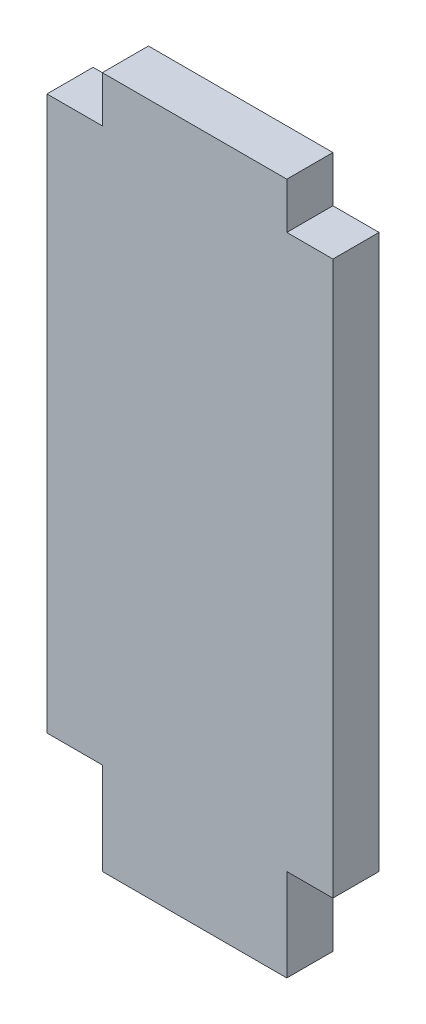
ISO-10303-21;
HEADER;
FILE_DESCRIPTION(('STEP AP214'),'2;1');
FILE_NAME('part.step','',(''),(''),'','','');
FILE_SCHEMA(('AUTOMOTIVE_DESIGN { 1 0 10303 214 1 1 1 1 }'));
ENDSEC;
DATA;
#1=APPLICATION_CONTEXT('core data for automotive mechanical design processes');
#2=APPLICATION_PROTOCOL_DEFINITION('international standard','automotive_design',2000,#1);
#3=PRODUCT_CONTEXT('',#1,'mechanical');
#4=PRODUCT('Part','Part','',(#3));
#5=PRODUCT_RELATED_PRODUCT_CATEGORY('part','',(#4));
#6=PRODUCT_DEFINITION_FORMATION('','',#4);
#7=PRODUCT_DEFINITION_CONTEXT('part definition',#1,'design');
#8=PRODUCT_DEFINITION('design','',#6,#7);
#9=PRODUCT_DEFINITION_SHAPE('','',#8);
#10=(LENGTH_UNIT() NAMED_UNIT(*) SI_UNIT(.MILLI.,.METRE.));
#11=(NAMED_UNIT(*) PLANE_ANGLE_UNIT() SI_UNIT($,.RADIAN.));
#12=(NAMED_UNIT(*) SI_UNIT($,.STERADIAN.) SOLID_ANGLE_UNIT());
#13=UNCERTAINTY_MEASURE_WITH_UNIT(LENGTH_MEASURE(1.E-05),#10,'distance_accuracy_value','');
#14=(GEOMETRIC_REPRESENTATION_CONTEXT(3) GLOBAL_UNCERTAINTY_ASSIGNED_CONTEXT((#13)) GLOBAL_UNIT_ASSIGNED_CONTEXT((#10,
#11,#12)) REPRESENTATION_CONTEXT('',''));
#15=CARTESIAN_POINT('',(0.,0.,0.));
#16=DIRECTION('',(0.,0.,1.));
#17=DIRECTION('',(1.,0.,0.));
#18=AXIS2_PLACEMENT_3D('',#15,#16,#17);
#19=CARTESIAN_POINT('',(-7.75,-13.75,2.5));
#20=DIRECTION('',(1.,0.,0.));
#21=DIRECTION('',(0.,1.,0.));
#22=AXIS2_PLACEMENT_3D('',#19,#20,#21);
#23=PLANE('',#22);
#24=DIRECTION('',(0.,-1.,0.));
#25=VECTOR('',#24,1.);
#26=CARTESIAN_POINT('',(-7.75,-13.75,0.));
#27=LINE('',#26,#25);
#28=CARTESIAN_POINT('',(-7.75,16.25,0.));
#29=VERTEX_POINT('',#28);
#30=CARTESIAN_POINT('',(-7.75,-13.75,0.));
#31=VERTEX_POINT('',#30);
#32=EDGE_CURVE('E153',#29,#31,#27,.T.);
#33=ORIENTED_EDGE('',*,*,#32,.T.);
#34=DIRECTION('',(0.,0.,-1.));
#35=VECTOR('',#34,1.);
#36=CARTESIAN_POINT('',(-7.75,-13.75,2.5));
#37=LINE('',#36,#35);
#38=CARTESIAN_POINT('',(-7.75,-13.75,2.5));
#39=VERTEX_POINT('',#38);
#40=EDGE_CURVE('E11',#39,#31,#37,.T.);
#41=ORIENTED_EDGE('',*,*,#40,.F.);
#42=DIRECTION('',(0.,-1.,0.));
#43=VECTOR('',#42,1.);
#44=CARTESIAN_POINT('',(-7.75,-13.75,2.5));
#45=LINE('',#44,#43);
#46=CARTESIAN_POINT('',(-7.75,16.25,2.5));
#47=VERTEX_POINT('',#46);
#48=EDGE_CURVE('E175',#47,#39,#45,.T.);
#49=ORIENTED_EDGE('',*,*,#48,.F.);
#50=DIRECTION('',(0.,0.,-1.));
#51=VECTOR('',#50,1.);
#52=CARTESIAN_POINT('',(-7.75,16.25,2.5));
#53=LINE('',#52,#51);
#54=EDGE_CURVE('E149',#47,#29,#53,.T.);
#55=ORIENTED_EDGE('',*,*,#54,.T.);
#56=EDGE_LOOP('',(#33,#41,#49,#55));
#57=FACE_BOUND('',#56,.T.);
#58=ADVANCED_FACE('F33',(#57),#23,.F.);
#59=CARTESIAN_POINT('',(-4.75,-13.75,2.5));
#60=DIRECTION('',(0.,1.,0.));
#61=DIRECTION('',(0.,0.,1.));
#62=AXIS2_PLACEMENT_3D('',#59,#60,#61);
#63=PLANE('',#62);
#64=DIRECTION('',(1.,0.,0.));
#65=VECTOR('',#64,1.);
#66=CARTESIAN_POINT('',(-4.75,-13.75,0.));
#67=LINE('',#66,#65);
#68=CARTESIAN_POINT('',(-4.75,-13.75,0.));
#69=VERTEX_POINT('',#68);
#70=EDGE_CURVE('E156',#31,#69,#67,.T.);
#71=ORIENTED_EDGE('',*,*,#70,.T.);
#72=DIRECTION('',(0.,0.,-1.));
#73=VECTOR('',#72,1.);
#74=CARTESIAN_POINT('',(-4.75,-13.75,2.5));
#75=LINE('',#74,#73);
#76=CARTESIAN_POINT('',(-4.75,-13.75,2.5));
#77=VERTEX_POINT('',#76);
#78=EDGE_CURVE('E41',#77,#69,#75,.T.);
#79=ORIENTED_EDGE('',*,*,#78,.F.);
#80=DIRECTION('',(1.,0.,0.));
#81=VECTOR('',#80,1.);
#82=CARTESIAN_POINT('',(-4.75,-13.75,2.5));
#83=LINE('',#82,#81);
#84=EDGE_CURVE('E104',#39,#77,#83,.T.);
#85=ORIENTED_EDGE('',*,*,#84,.F.);
#86=ORIENTED_EDGE('',*,*,#40,.T.);
#87=EDGE_LOOP('',(#71,#79,#85,#86));
#88=FACE_BOUND('',#87,.T.);
#89=ADVANCED_FACE('F253',(#88),#63,.F.);
#90=CARTESIAN_POINT('',(-4.75,-18.75,2.5));
#91=DIRECTION('',(1.,0.,0.));
#92=DIRECTION('',(0.,0.,-1.));
#93=AXIS2_PLACEMENT_3D('',#90,#91,#92);
#94=PLANE('',#93);
#95=DIRECTION('',(0.,-1.,0.));
#96=VECTOR('',#95,1.);
#97=CARTESIAN_POINT('',(-4.75,-18.75,0.));
#98=LINE('',#97,#96);
#99=CARTESIAN_POINT('',(-4.75,-18.75,0.));
#100=VERTEX_POINT('',#99);
#101=EDGE_CURVE('E158',#69,#100,#98,.T.);
#102=ORIENTED_EDGE('',*,*,#101,.T.);
#103=DIRECTION('',(0.,0.,-1.));
#104=VECTOR('',#103,1.);
#105=CARTESIAN_POINT('',(-4.75,-18.75,2.5));
#106=LINE('',#105,#104);
#107=CARTESIAN_POINT('',(-4.75,-18.75,2.5));
#108=VERTEX_POINT('',#107);
#109=EDGE_CURVE('E194',#108,#100,#106,.T.);
#110=ORIENTED_EDGE('',*,*,#109,.F.);
#111=DIRECTION('',(0.,-1.,0.));
#112=VECTOR('',#111,1.);
#113=CARTESIAN_POINT('',(-4.75,-18.75,2.5));
#114=LINE('',#113,#112);
#115=EDGE_CURVE('E202',#77,#108,#114,.T.);
#116=ORIENTED_EDGE('',*,*,#115,.F.);
#117=ORIENTED_EDGE('',*,*,#78,.T.);
#118=EDGE_LOOP('',(#102,#110,#116,#117));
#119=FACE_BOUND('',#118,.T.);
#120=ADVANCED_FACE('F200',(#119),#94,.F.);
#121=CARTESIAN_POINT('',(5.25,-18.75,2.5));
#122=DIRECTION('',(0.,1.,0.));
#123=DIRECTION('',(0.,0.,1.));
#124=AXIS2_PLACEMENT_3D('',#121,#122,#123);
#125=PLANE('',#124);
#126=DIRECTION('',(1.,0.,0.));
#127=VECTOR('',#126,1.);
#128=CARTESIAN_POINT('',(5.25,-18.75,0.));
#129=LINE('',#128,#127);
#130=CARTESIAN_POINT('',(5.25,-18.75,0.));
#131=VERTEX_POINT('',#130);
#132=EDGE_CURVE('E160',#100,#131,#129,.T.);
#133=ORIENTED_EDGE('',*,*,#132,.T.);
#134=DIRECTION('',(0.,0.,-1.));
#135=VECTOR('',#134,1.);
#136=CARTESIAN_POINT('',(5.25,-18.75,2.5));
#137=LINE('',#136,#135);
#138=CARTESIAN_POINT('',(5.25,-18.75,2.5));
#139=VERTEX_POINT('',#138);
#140=EDGE_CURVE('E191',#139,#131,#137,.T.);
#141=ORIENTED_EDGE('',*,*,#140,.F.);
#142=DIRECTION('',(1.,0.,0.));
#143=VECTOR('',#142,1.);
#144=CARTESIAN_POINT('',(5.25,-18.75,2.5));
#145=LINE('',#144,#143);
#146=EDGE_CURVE('E220',#108,#139,#145,.T.);
#147=ORIENTED_EDGE('',*,*,#146,.F.);
#148=ORIENTED_EDGE('',*,*,#109,.T.);
#149=EDGE_LOOP('',(#133,#141,#147,#148));
#150=FACE_BOUND('',#149,.T.);
#151=ADVANCED_FACE('F211',(#150),#125,.F.);
#152=CARTESIAN_POINT('',(5.25,-13.75,2.5));
#153=DIRECTION('',(-1.,0.,0.));
#154=DIRECTION('',(0.,0.,1.));
#155=AXIS2_PLACEMENT_3D('',#152,#153,#154);
#156=PLANE('',#155);
#157=DIRECTION('',(0.,1.,0.));
#158=VECTOR('',#157,1.);
#159=CARTESIAN_POINT('',(5.25,-13.75,0.));
#160=LINE('',#159,#158);
#161=CARTESIAN_POINT('',(5.25,-13.75,0.));
#162=VERTEX_POINT('',#161);
#163=EDGE_CURVE('E162',#131,#162,#160,.T.);
#164=ORIENTED_EDGE('',*,*,#163,.T.);
#165=DIRECTION('',(0.,0.,-1.));
#166=VECTOR('',#165,1.);
#167=CARTESIAN_POINT('',(5.25,-13.75,2.5));
#168=LINE('',#167,#166);
#169=CARTESIAN_POINT('',(5.25,-13.75,2.5));
#170=VERTEX_POINT('',#169);
#171=EDGE_CURVE('E188',#170,#162,#168,.T.);
#172=ORIENTED_EDGE('',*,*,#171,.F.);
#173=DIRECTION('',(0.,1.,0.));
#174=VECTOR('',#173,1.);
#175=CARTESIAN_POINT('',(5.25,-13.75,2.5));
#176=LINE('',#175,#174);
#177=EDGE_CURVE('E217',#139,#170,#176,.T.);
#178=ORIENTED_EDGE('',*,*,#177,.F.);
#179=ORIENTED_EDGE('',*,*,#140,.T.);
#180=EDGE_LOOP('',(#164,#172,#178,#179));
#181=FACE_BOUND('',#180,.T.);
#182=ADVANCED_FACE('F215',(#181),#156,.F.);
#183=CARTESIAN_POINT('',(7.75,-13.75,2.5));
#184=DIRECTION('',(0.,1.,0.));
#185=DIRECTION('',(0.,0.,1.));
#186=AXIS2_PLACEMENT_3D('',#183,#184,#185);
#187=PLANE('',#186);
#188=DIRECTION('',(1.,0.,0.));
#189=VECTOR('',#188,1.);
#190=CARTESIAN_POINT('',(7.75,-13.75,0.));
#191=LINE('',#190,#189);
#192=CARTESIAN_POINT('',(7.75,-13.75,0.));
#193=VERTEX_POINT('',#192);
#194=EDGE_CURVE('E164',#162,#193,#191,.T.);
#195=ORIENTED_EDGE('',*,*,#194,.T.);
#196=DIRECTION('',(0.,0.,-1.));
#197=VECTOR('',#196,1.);
#198=CARTESIAN_POINT('',(7.75,-13.75,2.5));
#199=LINE('',#198,#197);
#200=CARTESIAN_POINT('',(7.75,-13.75,2.5));
#201=VERTEX_POINT('',#200);
#202=EDGE_CURVE('E185',#201,#193,#199,.T.);
#203=ORIENTED_EDGE('',*,*,#202,.F.);
#204=DIRECTION('',(1.,0.,0.));
#205=VECTOR('',#204,1.);
#206=CARTESIAN_POINT('',(7.75,-13.75,2.5));
#207=LINE('',#206,#205);
#208=EDGE_CURVE('E219',#170,#201,#207,.T.);
#209=ORIENTED_EDGE('',*,*,#208,.F.);
#210=ORIENTED_EDGE('',*,*,#171,.T.);
#211=EDGE_LOOP('',(#195,#203,#209,#210));
#212=FACE_BOUND('',#211,.T.);
#213=ADVANCED_FACE('F266',(#212),#187,.F.);
#214=CARTESIAN_POINT('',(7.75,16.25,2.5));
#215=DIRECTION('',(-1.,0.,0.));
#216=DIRECTION('',(0.,0.,1.));
#217=AXIS2_PLACEMENT_3D('',#214,#215,#216);
#218=PLANE('',#217);
#219=DIRECTION('',(0.,1.,0.));
#220=VECTOR('',#219,1.);
#221=CARTESIAN_POINT('',(7.75,16.25,0.));
#222=LINE('',#221,#220);
#223=CARTESIAN_POINT('',(7.75,16.25,0.));
#224=VERTEX_POINT('',#223);
#225=EDGE_CURVE('E166',#193,#224,#222,.T.);
#226=ORIENTED_EDGE('',*,*,#225,.T.);
#227=DIRECTION('',(0.,0.,-1.));
#228=VECTOR('',#227,1.);
#229=CARTESIAN_POINT('',(7.75,16.25,2.5));
#230=LINE('',#229,#228);
#231=CARTESIAN_POINT('',(7.75,16.25,2.5));
#232=VERTEX_POINT('',#231);
#233=EDGE_CURVE('E182',#232,#224,#230,.T.);
#234=ORIENTED_EDGE('',*,*,#233,.F.);
#235=DIRECTION('',(0.,1.,0.));
#236=VECTOR('',#235,1.);
#237=CARTESIAN_POINT('',(7.75,16.25,2.5));
#238=LINE('',#237,#236);
#239=EDGE_CURVE('E222',#201,#232,#238,.T.);
#240=ORIENTED_EDGE('',*,*,#239,.F.);
#241=ORIENTED_EDGE('',*,*,#202,.T.);
#242=EDGE_LOOP('',(#226,#234,#240,#241));
#243=FACE_BOUND('',#242,.T.);
#244=ADVANCED_FACE('F269',(#243),#218,.F.);
#245=CARTESIAN_POINT('',(5.25,16.25,2.5));
#246=DIRECTION('',(0.,-1.,0.));
#247=DIRECTION('',(0.,0.,-1.));
#248=AXIS2_PLACEMENT_3D('',#245,#246,#247);
#249=PLANE('',#248);
#250=DIRECTION('',(-1.,0.,0.));
#251=VECTOR('',#250,1.);
#252=CARTESIAN_POINT('',(5.25,16.25,0.));
#253=LINE('',#252,#251);
#254=CARTESIAN_POINT('',(5.25,16.25,0.));
#255=VERTEX_POINT('',#254);
#256=EDGE_CURVE('E168',#224,#255,#253,.T.);
#257=ORIENTED_EDGE('',*,*,#256,.T.);
#258=DIRECTION('',(0.,0.,-1.));
#259=VECTOR('',#258,1.);
#260=CARTESIAN_POINT('',(5.25,16.25,2.5));
#261=LINE('',#260,#259);
#262=CARTESIAN_POINT('',(5.25,16.25,2.5));
#263=VERTEX_POINT('',#262);
#264=EDGE_CURVE('E179',#263,#255,#261,.T.);
#265=ORIENTED_EDGE('',*,*,#264,.F.);
#266=DIRECTION('',(-1.,0.,0.));
#267=VECTOR('',#266,1.);
#268=CARTESIAN_POINT('',(5.25,16.25,2.5));
#269=LINE('',#268,#267);
#270=EDGE_CURVE('E228',#232,#263,#269,.T.);
#271=ORIENTED_EDGE('',*,*,#270,.F.);
#272=ORIENTED_EDGE('',*,*,#233,.T.);
#273=EDGE_LOOP('',(#257,#265,#271,#272));
#274=FACE_BOUND('',#273,.T.);
#275=ADVANCED_FACE('F234',(#274),#249,.F.);
#276=CARTESIAN_POINT('',(5.25,18.75,2.5));
#277=DIRECTION('',(-1.,0.,0.));
#278=DIRECTION('',(0.,0.,1.));
#279=AXIS2_PLACEMENT_3D('',#276,#277,#278);
#280=PLANE('',#279);
#281=DIRECTION('',(0.,1.,0.));
#282=VECTOR('',#281,1.);
#283=CARTESIAN_POINT('',(5.25,18.75,0.));
#284=LINE('',#283,#282);
#285=CARTESIAN_POINT('',(5.25,18.75,0.));
#286=VERTEX_POINT('',#285);
#287=EDGE_CURVE('E170',#255,#286,#284,.T.);
#288=ORIENTED_EDGE('',*,*,#287,.T.);
#289=DIRECTION('',(0.,0.,-1.));
#290=VECTOR('',#289,1.);
#291=CARTESIAN_POINT('',(5.25,18.75,2.5));
#292=LINE('',#291,#290);
#293=CARTESIAN_POINT('',(5.25,18.75,2.5));
#294=VERTEX_POINT('',#293);
#295=EDGE_CURVE('E144',#294,#286,#292,.T.);
#296=ORIENTED_EDGE('',*,*,#295,.F.);
#297=DIRECTION('',(0.,1.,0.));
#298=VECTOR('',#297,1.);
#299=CARTESIAN_POINT('',(5.25,18.75,2.5));
#300=LINE('',#299,#298);
#301=EDGE_CURVE('E135',#263,#294,#300,.T.);
#302=ORIENTED_EDGE('',*,*,#301,.F.);
#303=ORIENTED_EDGE('',*,*,#264,.T.);
#304=EDGE_LOOP('',(#288,#296,#302,#303));
#305=FACE_BOUND('',#304,.T.);
#306=ADVANCED_FACE('F238',(#305),#280,.F.);
#307=CARTESIAN_POINT('',(-4.75,18.75,2.5));
#308=DIRECTION('',(0.,-1.,0.));
#309=DIRECTION('',(0.,0.,-1.));
#310=AXIS2_PLACEMENT_3D('',#307,#308,#309);
#311=PLANE('',#310);
#312=DIRECTION('',(-1.,0.,0.));
#313=VECTOR('',#312,1.);
#314=CARTESIAN_POINT('',(-4.75,18.75,0.));
#315=LINE('',#314,#313);
#316=CARTESIAN_POINT('',(-4.75,18.75,0.));
#317=VERTEX_POINT('',#316);
#318=EDGE_CURVE('E143',#286,#317,#315,.T.);
#319=ORIENTED_EDGE('',*,*,#318,.T.);
#320=DIRECTION('',(0.,0.,-1.));
#321=VECTOR('',#320,1.);
#322=CARTESIAN_POINT('',(-4.75,18.75,2.5));
#323=LINE('',#322,#321);
#324=CARTESIAN_POINT('',(-4.75,18.75,2.5));
#325=VERTEX_POINT('',#324);
#326=EDGE_CURVE('E140',#325,#317,#323,.T.);
#327=ORIENTED_EDGE('',*,*,#326,.F.);
#328=DIRECTION('',(-1.,0.,0.));
#329=VECTOR('',#328,1.);
#330=CARTESIAN_POINT('',(-4.75,18.75,2.5));
#331=LINE('',#330,#329);
#332=EDGE_CURVE('E129',#294,#325,#331,.T.);
#333=ORIENTED_EDGE('',*,*,#332,.F.);
#334=ORIENTED_EDGE('',*,*,#295,.T.);
#335=EDGE_LOOP('',(#319,#327,#333,#334));
#336=FACE_BOUND('',#335,.T.);
#337=ADVANCED_FACE('F141',(#336),#311,.F.);
#338=CARTESIAN_POINT('',(-4.75,16.25,2.5));
#339=DIRECTION('',(1.,0.,0.));
#340=DIRECTION('',(0.,0.,-1.));
#341=AXIS2_PLACEMENT_3D('',#338,#339,#340);
#342=PLANE('',#341);
#343=DIRECTION('',(0.,-1.,0.));
#344=VECTOR('',#343,1.);
#345=CARTESIAN_POINT('',(-4.75,16.25,0.));
#346=LINE('',#345,#344);
#347=CARTESIAN_POINT('',(-4.75,16.25,0.));
#348=VERTEX_POINT('',#347);
#349=EDGE_CURVE('E90',#317,#348,#346,.T.);
#350=ORIENTED_EDGE('',*,*,#349,.T.);
#351=DIRECTION('',(0.,0.,-1.));
#352=VECTOR('',#351,1.);
#353=CARTESIAN_POINT('',(-4.75,16.25,2.5));
#354=LINE('',#353,#352);
#355=CARTESIAN_POINT('',(-4.75,16.25,2.5));
#356=VERTEX_POINT('',#355);
#357=EDGE_CURVE('E145',#356,#348,#354,.T.);
#358=ORIENTED_EDGE('',*,*,#357,.F.);
#359=DIRECTION('',(0.,-1.,0.));
#360=VECTOR('',#359,1.);
#361=CARTESIAN_POINT('',(-4.75,16.25,2.5));
#362=LINE('',#361,#360);
#363=EDGE_CURVE('E133',#325,#356,#362,.T.);
#364=ORIENTED_EDGE('',*,*,#363,.F.);
#365=ORIENTED_EDGE('',*,*,#326,.T.);
#366=EDGE_LOOP('',(#350,#358,#364,#365));
#367=FACE_BOUND('',#366,.T.);
#368=ADVANCED_FACE('F147',(#367),#342,.F.);
#369=CARTESIAN_POINT('',(-7.75,16.25,2.5));
#370=DIRECTION('',(0.,-1.,0.));
#371=DIRECTION('',(0.,0.,-1.));
#372=AXIS2_PLACEMENT_3D('',#369,#370,#371);
#373=PLANE('',#372);
#374=DIRECTION('',(-1.,0.,0.));
#375=VECTOR('',#374,1.);
#376=CARTESIAN_POINT('',(-7.75,16.25,0.));
#377=LINE('',#376,#375);
#378=EDGE_CURVE('E96',#348,#29,#377,.T.);
#379=ORIENTED_EDGE('',*,*,#378,.T.);
#380=ORIENTED_EDGE('',*,*,#54,.F.);
#381=DIRECTION('',(-1.,0.,0.));
#382=VECTOR('',#381,1.);
#383=CARTESIAN_POINT('',(-7.75,16.25,2.5));
#384=LINE('',#383,#382);
#385=EDGE_CURVE('E49',#356,#47,#384,.T.);
#386=ORIENTED_EDGE('',*,*,#385,.F.);
#387=ORIENTED_EDGE('',*,*,#357,.T.);
#388=EDGE_LOOP('',(#379,#380,#386,#387));
#389=FACE_BOUND('',#388,.T.);
#390=ADVANCED_FACE('F242',(#389),#373,.F.);
#391=CARTESIAN_POINT('',(0.,0.,2.5));
#392=DIRECTION('',(0.,0.,-1.));
#393=DIRECTION('',(-1.,0.,0.));
#394=AXIS2_PLACEMENT_3D('',#391,#392,#393);
#395=PLANE('',#394);
#396=ORIENTED_EDGE('',*,*,#48,.T.);
#397=ORIENTED_EDGE('',*,*,#84,.T.);
#398=ORIENTED_EDGE('',*,*,#115,.T.);
#399=ORIENTED_EDGE('',*,*,#146,.T.);
#400=ORIENTED_EDGE('',*,*,#177,.T.);
#401=ORIENTED_EDGE('',*,*,#208,.T.);
#402=ORIENTED_EDGE('',*,*,#239,.T.);
#403=ORIENTED_EDGE('',*,*,#270,.T.);
#404=ORIENTED_EDGE('',*,*,#301,.T.);
#405=ORIENTED_EDGE('',*,*,#332,.T.);
#406=ORIENTED_EDGE('',*,*,#363,.T.);
#407=ORIENTED_EDGE('',*,*,#385,.T.);
#408=EDGE_LOOP('',(#396,#397,#398,#399,#400,#401,#402,#403,#404,#405,#406,#407));
#409=FACE_BOUND('',#408,.T.);
#410=ADVANCED_FACE('F131',(#409),#395,.F.);
#411=CARTESIAN_POINT('',(0.,0.,0.));
#412=DIRECTION('',(0.,0.,-1.));
#413=DIRECTION('',(-1.,0.,0.));
#414=AXIS2_PLACEMENT_3D('',#411,#412,#413);
#415=PLANE('',#414);
#416=ORIENTED_EDGE('',*,*,#32,.F.);
#417=ORIENTED_EDGE('',*,*,#378,.F.);
#418=ORIENTED_EDGE('',*,*,#349,.F.);
#419=ORIENTED_EDGE('',*,*,#318,.F.);
#420=ORIENTED_EDGE('',*,*,#287,.F.);
#421=ORIENTED_EDGE('',*,*,#256,.F.);
#422=ORIENTED_EDGE('',*,*,#225,.F.);
#423=ORIENTED_EDGE('',*,*,#194,.F.);
#424=ORIENTED_EDGE('',*,*,#163,.F.);
#425=ORIENTED_EDGE('',*,*,#132,.F.);
#426=ORIENTED_EDGE('',*,*,#101,.F.);
#427=ORIENTED_EDGE('',*,*,#70,.F.);
#428=EDGE_LOOP('',(#416,#417,#418,#419,#420,#421,#422,#423,#424,#425,#426,#427));
#429=FACE_BOUND('',#428,.T.);
#430=ADVANCED_FACE('F206',(#429),#415,.T.);
#431=CLOSED_SHELL('',(#58,#89,#120,#151,#182,#213,#244,#275,#306,#337,#368,#390,#410,#430));
#432=MANIFOLD_SOLID_BREP('B2',#431);
#433=ADVANCED_BREP_SHAPE_REPRESENTATION('',(#18,#432),#14);
#434=SHAPE_DEFINITION_REPRESENTATION(#9,#433);
ENDSEC;
END-ISO-10303-21;
